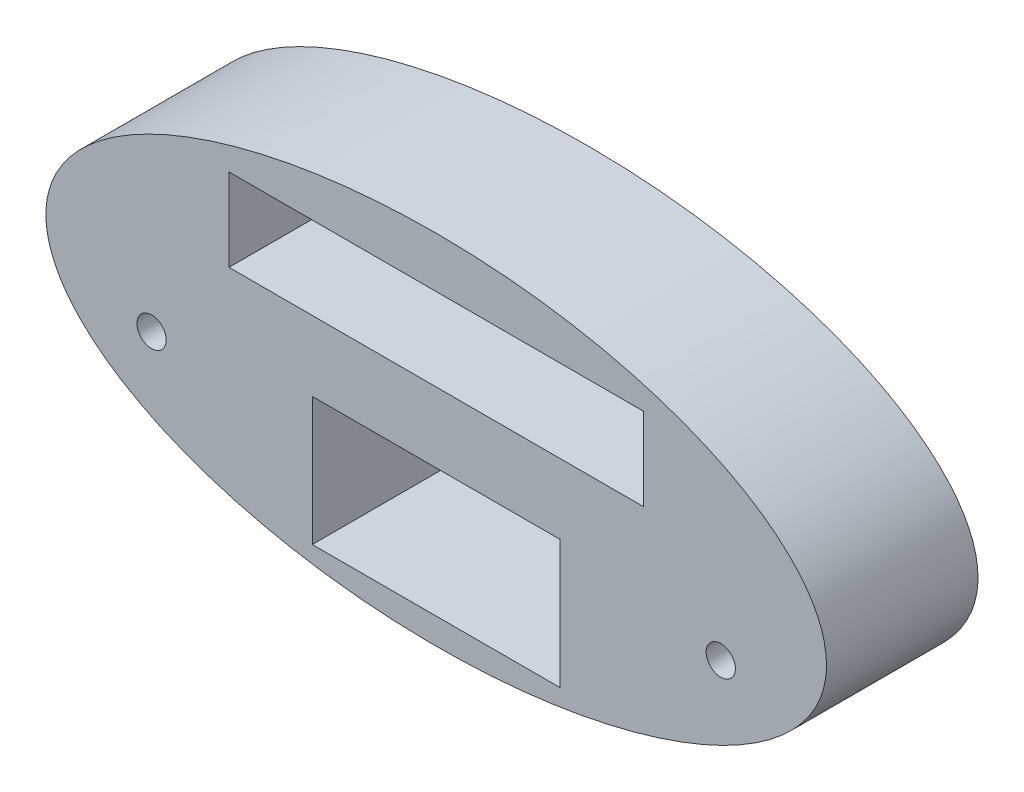
ISO-10303-21;
HEADER;
FILE_DESCRIPTION(('STEP AP214'),'2;1');
FILE_NAME('part.step','',(''),(''),'','','');
FILE_SCHEMA(('AUTOMOTIVE_DESIGN { 1 0 10303 214 1 1 1 1 }'));
ENDSEC;
DATA;
#1=APPLICATION_CONTEXT('core data for automotive mechanical design processes');
#2=APPLICATION_PROTOCOL_DEFINITION('international standard','automotive_design',2000,#1);
#3=PRODUCT_CONTEXT('',#1,'mechanical');
#4=PRODUCT('Part','Part','',(#3));
#5=PRODUCT_RELATED_PRODUCT_CATEGORY('part','',(#4));
#6=PRODUCT_DEFINITION_FORMATION('','',#4);
#7=PRODUCT_DEFINITION_CONTEXT('part definition',#1,'design');
#8=PRODUCT_DEFINITION('design','',#6,#7);
#9=PRODUCT_DEFINITION_SHAPE('','',#8);
#10=(LENGTH_UNIT() NAMED_UNIT(*) SI_UNIT(.MILLI.,.METRE.));
#11=(NAMED_UNIT(*) PLANE_ANGLE_UNIT() SI_UNIT($,.RADIAN.));
#12=(NAMED_UNIT(*) SI_UNIT($,.STERADIAN.) SOLID_ANGLE_UNIT());
#13=UNCERTAINTY_MEASURE_WITH_UNIT(LENGTH_MEASURE(1.E-05),#10,'distance_accuracy_value','');
#14=(GEOMETRIC_REPRESENTATION_CONTEXT(3) GLOBAL_UNCERTAINTY_ASSIGNED_CONTEXT((#13)) GLOBAL_UNIT_ASSIGNED_CONTEXT((#10,
#11,#12)) REPRESENTATION_CONTEXT('',''));
#15=CARTESIAN_POINT('',(0.,0.,0.));
#16=DIRECTION('',(0.,0.,1.));
#17=DIRECTION('',(1.,0.,0.));
#18=AXIS2_PLACEMENT_3D('',#15,#16,#17);
#19=CARTESIAN_POINT('',(0.,0.,-93.165));
#20=DIRECTION('',(0.,0.,1.));
#21=DIRECTION('',(1.,0.,0.));
#22=AXIS2_PLACEMENT_3D('',#19,#20,#21);
#23=ELLIPSE('',#22,240.,110.);
#24=DIRECTION('',(0.,0.,1.));
#25=VECTOR('',#24,1.);
#26=SURFACE_OF_LINEAR_EXTRUSION('',#23,#25);
#27=CARTESIAN_POINT('',(240.,0.,-93.165));
#28=VERTEX_POINT('',#27);
#29=EDGE_CURVE('E11',#28,#28,#23,.T.);
#30=ORIENTED_EDGE('',*,*,#29,.T.);
#31=EDGE_LOOP('',(#30));
#32=FACE_BOUND('',#31,.T.);
#33=CARTESIAN_POINT('',(0.,0.,0.));
#34=DIRECTION('',(0.,0.,1.));
#35=DIRECTION('',(1.,0.,0.));
#36=AXIS2_PLACEMENT_3D('',#33,#34,#35);
#37=ELLIPSE('',#36,240.,110.);
#38=CARTESIAN_POINT('',(240.,0.,0.));
#39=VERTEX_POINT('',#38);
#40=EDGE_CURVE('E39',#39,#39,#37,.T.);
#41=ORIENTED_EDGE('',*,*,#40,.F.);
#42=EDGE_LOOP('',(#41));
#43=FACE_BOUND('',#42,.T.);
#44=ADVANCED_FACE('F35',(#32,#43),#26,.T.);
#45=CARTESIAN_POINT('',(0.,0.,-93.165));
#46=DIRECTION('',(0.,0.,1.));
#47=DIRECTION('',(1.,0.,0.));
#48=AXIS2_PLACEMENT_3D('',#45,#46,#47);
#49=PLANE('',#48);
#50=CARTESIAN_POINT('',(175.,-30.,-93.165));
#51=DIRECTION('',(0.,0.,1.));
#52=DIRECTION('',(1.,0.,0.));
#53=AXIS2_PLACEMENT_3D('',#50,#51,#52);
#54=CIRCLE('',#53,9.00000000000001);
#55=CARTESIAN_POINT('',(184.,-30.,-93.165));
#56=VERTEX_POINT('',#55);
#57=EDGE_CURVE('E130',#56,#56,#54,.T.);
#58=ORIENTED_EDGE('',*,*,#57,.T.);
#59=EDGE_LOOP('',(#58));
#60=FACE_BOUND('',#59,.T.);
#61=CARTESIAN_POINT('',(-175.,-30.,-93.165));
#62=DIRECTION('',(0.,0.,1.));
#63=DIRECTION('',(-1.,0.,0.));
#64=AXIS2_PLACEMENT_3D('',#61,#62,#63);
#65=CIRCLE('',#64,9.00000000000001);
#66=CARTESIAN_POINT('',(-184.,-30.,-93.165));
#67=VERTEX_POINT('',#66);
#68=EDGE_CURVE('E248',#67,#67,#65,.T.);
#69=ORIENTED_EDGE('',*,*,#68,.T.);
#70=EDGE_LOOP('',(#69));
#71=FACE_BOUND('',#70,.T.);
#72=DIRECTION('',(-1.,0.,0.));
#73=VECTOR('',#72,1.);
#74=CARTESIAN_POINT('',(-76.2,-15.,-93.165));
#75=LINE('',#74,#73);
#76=CARTESIAN_POINT('',(76.2,-15.,-93.165));
#77=VERTEX_POINT('',#76);
#78=CARTESIAN_POINT('',(-76.2,-15.,-93.165));
#79=VERTEX_POINT('',#78);
#80=EDGE_CURVE('E107',#77,#79,#75,.T.);
#81=ORIENTED_EDGE('',*,*,#80,.T.);
#82=DIRECTION('',(0.,-1.,0.));
#83=VECTOR('',#82,1.);
#84=CARTESIAN_POINT('',(-76.2,-15.,-93.165));
#85=LINE('',#84,#83);
#86=CARTESIAN_POINT('',(-76.2,-93.9,-93.165));
#87=VERTEX_POINT('',#86);
#88=EDGE_CURVE('E101',#79,#87,#85,.T.);
#89=ORIENTED_EDGE('',*,*,#88,.T.);
#90=DIRECTION('',(1.,0.,0.));
#91=VECTOR('',#90,1.);
#92=CARTESIAN_POINT('',(-76.2,-93.9,-93.165));
#93=LINE('',#92,#91);
#94=CARTESIAN_POINT('',(76.2,-93.9,-93.165));
#95=VERTEX_POINT('',#94);
#96=EDGE_CURVE('E110',#87,#95,#93,.T.);
#97=ORIENTED_EDGE('',*,*,#96,.T.);
#98=DIRECTION('',(0.,1.,0.));
#99=VECTOR('',#98,1.);
#100=CARTESIAN_POINT('',(76.2,-15.,-93.165));
#101=LINE('',#100,#99);
#102=EDGE_CURVE('E49',#95,#77,#101,.T.);
#103=ORIENTED_EDGE('',*,*,#102,.T.);
#104=EDGE_LOOP('',(#81,#89,#97,#103));
#105=FACE_BOUND('',#104,.T.);
#106=DIRECTION('',(-1.,0.,0.));
#107=VECTOR('',#106,1.);
#108=CARTESIAN_POINT('',(-127.4,78.9000000000001,-93.165));
#109=LINE('',#108,#107);
#110=CARTESIAN_POINT('',(127.4,78.9,-93.165));
#111=VERTEX_POINT('',#110);
#112=CARTESIAN_POINT('',(-127.4,78.9000000000001,-93.165));
#113=VERTEX_POINT('',#112);
#114=EDGE_CURVE('E150',#111,#113,#109,.T.);
#115=ORIENTED_EDGE('',*,*,#114,.T.);
#116=DIRECTION('',(0.,-1.,0.));
#117=VECTOR('',#116,1.);
#118=CARTESIAN_POINT('',(-127.4,78.9000000000001,-93.165));
#119=LINE('',#118,#117);
#120=CARTESIAN_POINT('',(-127.4,28.1,-93.165));
#121=VERTEX_POINT('',#120);
#122=EDGE_CURVE('E140',#113,#121,#119,.T.);
#123=ORIENTED_EDGE('',*,*,#122,.T.);
#124=DIRECTION('',(1.,0.,0.));
#125=VECTOR('',#124,1.);
#126=CARTESIAN_POINT('',(-127.4,28.1,-93.165));
#127=LINE('',#126,#125);
#128=CARTESIAN_POINT('',(127.4,28.1,-93.165));
#129=VERTEX_POINT('',#128);
#130=EDGE_CURVE('E143',#121,#129,#127,.T.);
#131=ORIENTED_EDGE('',*,*,#130,.T.);
#132=DIRECTION('',(0.,1.,0.));
#133=VECTOR('',#132,1.);
#134=CARTESIAN_POINT('',(127.4,78.9,-93.165));
#135=LINE('',#134,#133);
#136=EDGE_CURVE('E147',#129,#111,#135,.T.);
#137=ORIENTED_EDGE('',*,*,#136,.T.);
#138=EDGE_LOOP('',(#115,#123,#131,#137));
#139=FACE_BOUND('',#138,.T.);
#140=ORIENTED_EDGE('',*,*,#29,.F.);
#141=EDGE_LOOP('',(#140));
#142=FACE_BOUND('',#141,.T.);
#143=ADVANCED_FACE('F114',(#60,#71,#105,#139,#142),#49,.F.);
#144=CARTESIAN_POINT('',(0.,0.,0.));
#145=DIRECTION('',(0.,0.,1.));
#146=DIRECTION('',(1.,0.,0.));
#147=AXIS2_PLACEMENT_3D('',#144,#145,#146);
#148=PLANE('',#147);
#149=CARTESIAN_POINT('',(175.,-30.,0.));
#150=DIRECTION('',(0.,0.,1.));
#151=DIRECTION('',(1.,0.,0.));
#152=AXIS2_PLACEMENT_3D('',#149,#150,#151);
#153=CIRCLE('',#152,9.00000000000001);
#154=CARTESIAN_POINT('',(184.,-30.,0.));
#155=VERTEX_POINT('',#154);
#156=EDGE_CURVE('E247',#155,#155,#153,.T.);
#157=ORIENTED_EDGE('',*,*,#156,.F.);
#158=EDGE_LOOP('',(#157));
#159=FACE_BOUND('',#158,.T.);
#160=CARTESIAN_POINT('',(-175.,-30.,0.));
#161=DIRECTION('',(0.,0.,1.));
#162=DIRECTION('',(-1.,0.,0.));
#163=AXIS2_PLACEMENT_3D('',#160,#161,#162);
#164=CIRCLE('',#163,9.00000000000001);
#165=CARTESIAN_POINT('',(-184.,-30.,0.));
#166=VERTEX_POINT('',#165);
#167=EDGE_CURVE('E123',#166,#166,#164,.T.);
#168=ORIENTED_EDGE('',*,*,#167,.F.);
#169=EDGE_LOOP('',(#168));
#170=FACE_BOUND('',#169,.T.);
#171=DIRECTION('',(0.,-1.,0.));
#172=VECTOR('',#171,1.);
#173=CARTESIAN_POINT('',(-76.2,-15.,0.));
#174=LINE('',#173,#172);
#175=CARTESIAN_POINT('',(-76.2,-15.,0.));
#176=VERTEX_POINT('',#175);
#177=CARTESIAN_POINT('',(-76.2,-93.9,0.));
#178=VERTEX_POINT('',#177);
#179=EDGE_CURVE('E57',#176,#178,#174,.T.);
#180=ORIENTED_EDGE('',*,*,#179,.F.);
#181=DIRECTION('',(-1.,0.,0.));
#182=VECTOR('',#181,1.);
#183=CARTESIAN_POINT('',(-76.2,-15.,0.));
#184=LINE('',#183,#182);
#185=CARTESIAN_POINT('',(76.2,-15.,0.));
#186=VERTEX_POINT('',#185);
#187=EDGE_CURVE('E117',#186,#176,#184,.T.);
#188=ORIENTED_EDGE('',*,*,#187,.F.);
#189=DIRECTION('',(0.,1.,0.));
#190=VECTOR('',#189,1.);
#191=CARTESIAN_POINT('',(76.2,-15.,0.));
#192=LINE('',#191,#190);
#193=CARTESIAN_POINT('',(76.2,-93.9,0.));
#194=VERTEX_POINT('',#193);
#195=EDGE_CURVE('E120',#194,#186,#192,.T.);
#196=ORIENTED_EDGE('',*,*,#195,.F.);
#197=DIRECTION('',(1.,0.,0.));
#198=VECTOR('',#197,1.);
#199=CARTESIAN_POINT('',(-76.2,-93.9,0.));
#200=LINE('',#199,#198);
#201=EDGE_CURVE('E129',#178,#194,#200,.T.);
#202=ORIENTED_EDGE('',*,*,#201,.F.);
#203=EDGE_LOOP('',(#180,#188,#196,#202));
#204=FACE_BOUND('',#203,.T.);
#205=DIRECTION('',(0.,-1.,0.));
#206=VECTOR('',#205,1.);
#207=CARTESIAN_POINT('',(-127.4,78.9000000000001,0.));
#208=LINE('',#207,#206);
#209=CARTESIAN_POINT('',(-127.4,78.9000000000001,0.));
#210=VERTEX_POINT('',#209);
#211=CARTESIAN_POINT('',(-127.4,28.1,0.));
#212=VERTEX_POINT('',#211);
#213=EDGE_CURVE('E136',#210,#212,#208,.T.);
#214=ORIENTED_EDGE('',*,*,#213,.F.);
#215=DIRECTION('',(-1.,0.,0.));
#216=VECTOR('',#215,1.);
#217=CARTESIAN_POINT('',(-127.4,78.9000000000001,0.));
#218=LINE('',#217,#216);
#219=CARTESIAN_POINT('',(127.4,78.9,0.));
#220=VERTEX_POINT('',#219);
#221=EDGE_CURVE('E144',#220,#210,#218,.T.);
#222=ORIENTED_EDGE('',*,*,#221,.F.);
#223=DIRECTION('',(0.,1.,0.));
#224=VECTOR('',#223,1.);
#225=CARTESIAN_POINT('',(127.4,78.9,0.));
#226=LINE('',#225,#224);
#227=CARTESIAN_POINT('',(127.4,28.1,0.));
#228=VERTEX_POINT('',#227);
#229=EDGE_CURVE('E158',#228,#220,#226,.T.);
#230=ORIENTED_EDGE('',*,*,#229,.F.);
#231=DIRECTION('',(1.,0.,0.));
#232=VECTOR('',#231,1.);
#233=CARTESIAN_POINT('',(-127.4,28.1,0.));
#234=LINE('',#233,#232);
#235=EDGE_CURVE('E155',#212,#228,#234,.T.);
#236=ORIENTED_EDGE('',*,*,#235,.F.);
#237=EDGE_LOOP('',(#214,#222,#230,#236));
#238=FACE_BOUND('',#237,.T.);
#239=ORIENTED_EDGE('',*,*,#40,.T.);
#240=EDGE_LOOP('',(#239));
#241=FACE_BOUND('',#240,.T.);
#242=ADVANCED_FACE('F181',(#159,#170,#204,#238,#241),#148,.T.);
#243=CARTESIAN_POINT('',(-127.4,78.9000000000001,-93.165));
#244=DIRECTION('',(-1.,0.,0.));
#245=DIRECTION('',(0.,0.,1.));
#246=AXIS2_PLACEMENT_3D('',#243,#244,#245);
#247=PLANE('',#246);
#248=ORIENTED_EDGE('',*,*,#213,.T.);
#249=DIRECTION('',(0.,0.,1.));
#250=VECTOR('',#249,1.);
#251=CARTESIAN_POINT('',(-127.4,28.1,-93.165));
#252=LINE('',#251,#250);
#253=EDGE_CURVE('E153',#121,#212,#252,.T.);
#254=ORIENTED_EDGE('',*,*,#253,.F.);
#255=ORIENTED_EDGE('',*,*,#122,.F.);
#256=DIRECTION('',(0.,0.,1.));
#257=VECTOR('',#256,1.);
#258=CARTESIAN_POINT('',(-127.4,78.9000000000001,-93.165));
#259=LINE('',#258,#257);
#260=EDGE_CURVE('E163',#113,#210,#259,.T.);
#261=ORIENTED_EDGE('',*,*,#260,.T.);
#262=EDGE_LOOP('',(#248,#254,#255,#261));
#263=FACE_BOUND('',#262,.T.);
#264=ADVANCED_FACE('F188',(#263),#247,.F.);
#265=CARTESIAN_POINT('',(-127.4,78.9000000000001,-93.165));
#266=DIRECTION('',(0.,1.,0.));
#267=DIRECTION('',(-1.,0.,0.));
#268=AXIS2_PLACEMENT_3D('',#265,#266,#267);
#269=PLANE('',#268);
#270=ORIENTED_EDGE('',*,*,#221,.T.);
#271=ORIENTED_EDGE('',*,*,#260,.F.);
#272=ORIENTED_EDGE('',*,*,#114,.F.);
#273=DIRECTION('',(0.,0.,1.));
#274=VECTOR('',#273,1.);
#275=CARTESIAN_POINT('',(127.4,78.9,-93.165));
#276=LINE('',#275,#274);
#277=EDGE_CURVE('E165',#111,#220,#276,.T.);
#278=ORIENTED_EDGE('',*,*,#277,.T.);
#279=EDGE_LOOP('',(#270,#271,#272,#278));
#280=FACE_BOUND('',#279,.T.);
#281=ADVANCED_FACE('F190',(#280),#269,.F.);
#282=CARTESIAN_POINT('',(127.4,78.9,-93.165));
#283=DIRECTION('',(1.,0.,0.));
#284=DIRECTION('',(0.,0.,-1.));
#285=AXIS2_PLACEMENT_3D('',#282,#283,#284);
#286=PLANE('',#285);
#287=ORIENTED_EDGE('',*,*,#229,.T.);
#288=ORIENTED_EDGE('',*,*,#277,.F.);
#289=ORIENTED_EDGE('',*,*,#136,.F.);
#290=DIRECTION('',(0.,0.,1.));
#291=VECTOR('',#290,1.);
#292=CARTESIAN_POINT('',(127.4,28.1,-93.165));
#293=LINE('',#292,#291);
#294=EDGE_CURVE('E167',#129,#228,#293,.T.);
#295=ORIENTED_EDGE('',*,*,#294,.T.);
#296=EDGE_LOOP('',(#287,#288,#289,#295));
#297=FACE_BOUND('',#296,.T.);
#298=ADVANCED_FACE('F185',(#297),#286,.F.);
#299=CARTESIAN_POINT('',(-127.4,28.1,-93.165));
#300=DIRECTION('',(0.,-1.,0.));
#301=DIRECTION('',(1.,0.,0.));
#302=AXIS2_PLACEMENT_3D('',#299,#300,#301);
#303=PLANE('',#302);
#304=ORIENTED_EDGE('',*,*,#235,.T.);
#305=ORIENTED_EDGE('',*,*,#294,.F.);
#306=ORIENTED_EDGE('',*,*,#130,.F.);
#307=ORIENTED_EDGE('',*,*,#253,.T.);
#308=EDGE_LOOP('',(#304,#305,#306,#307));
#309=FACE_BOUND('',#308,.T.);
#310=ADVANCED_FACE('F174',(#309),#303,.F.);
#311=CARTESIAN_POINT('',(-76.2,-15.,-93.165));
#312=DIRECTION('',(-1.,0.,0.));
#313=DIRECTION('',(0.,-1.,0.));
#314=AXIS2_PLACEMENT_3D('',#311,#312,#313);
#315=PLANE('',#314);
#316=ORIENTED_EDGE('',*,*,#179,.T.);
#317=DIRECTION('',(0.,0.,1.));
#318=VECTOR('',#317,1.);
#319=CARTESIAN_POINT('',(-76.2,-93.9,-93.165));
#320=LINE('',#319,#318);
#321=EDGE_CURVE('E97',#87,#178,#320,.T.);
#322=ORIENTED_EDGE('',*,*,#321,.F.);
#323=ORIENTED_EDGE('',*,*,#88,.F.);
#324=DIRECTION('',(0.,0.,1.));
#325=VECTOR('',#324,1.);
#326=CARTESIAN_POINT('',(-76.2,-15.,-93.165));
#327=LINE('',#326,#325);
#328=EDGE_CURVE('E134',#79,#176,#327,.T.);
#329=ORIENTED_EDGE('',*,*,#328,.T.);
#330=EDGE_LOOP('',(#316,#322,#323,#329));
#331=FACE_BOUND('',#330,.T.);
#332=ADVANCED_FACE('F99',(#331),#315,.F.);
#333=CARTESIAN_POINT('',(-76.2,-15.,-93.165));
#334=DIRECTION('',(0.,1.,0.));
#335=DIRECTION('',(0.,0.,1.));
#336=AXIS2_PLACEMENT_3D('',#333,#334,#335);
#337=PLANE('',#336);
#338=ORIENTED_EDGE('',*,*,#187,.T.);
#339=ORIENTED_EDGE('',*,*,#328,.F.);
#340=ORIENTED_EDGE('',*,*,#80,.F.);
#341=DIRECTION('',(0.,0.,1.));
#342=VECTOR('',#341,1.);
#343=CARTESIAN_POINT('',(76.2,-15.,-93.165));
#344=LINE('',#343,#342);
#345=EDGE_CURVE('E137',#77,#186,#344,.T.);
#346=ORIENTED_EDGE('',*,*,#345,.T.);
#347=EDGE_LOOP('',(#338,#339,#340,#346));
#348=FACE_BOUND('',#347,.T.);
#349=ADVANCED_FACE('F222',(#348),#337,.F.);
#350=CARTESIAN_POINT('',(76.2,-15.,-93.165));
#351=DIRECTION('',(1.,0.,0.));
#352=DIRECTION('',(0.,1.,0.));
#353=AXIS2_PLACEMENT_3D('',#350,#351,#352);
#354=PLANE('',#353);
#355=ORIENTED_EDGE('',*,*,#195,.T.);
#356=ORIENTED_EDGE('',*,*,#345,.F.);
#357=ORIENTED_EDGE('',*,*,#102,.F.);
#358=DIRECTION('',(0.,0.,1.));
#359=VECTOR('',#358,1.);
#360=CARTESIAN_POINT('',(76.2,-93.9,-93.165));
#361=LINE('',#360,#359);
#362=EDGE_CURVE('E106',#95,#194,#361,.T.);
#363=ORIENTED_EDGE('',*,*,#362,.T.);
#364=EDGE_LOOP('',(#355,#356,#357,#363));
#365=FACE_BOUND('',#364,.T.);
#366=ADVANCED_FACE('F226',(#365),#354,.F.);
#367=CARTESIAN_POINT('',(-76.2,-93.9,-93.165));
#368=DIRECTION('',(0.,-1.,0.));
#369=DIRECTION('',(0.,0.,-1.));
#370=AXIS2_PLACEMENT_3D('',#367,#368,#369);
#371=PLANE('',#370);
#372=ORIENTED_EDGE('',*,*,#201,.T.);
#373=ORIENTED_EDGE('',*,*,#362,.F.);
#374=ORIENTED_EDGE('',*,*,#96,.F.);
#375=ORIENTED_EDGE('',*,*,#321,.T.);
#376=EDGE_LOOP('',(#372,#373,#374,#375));
#377=FACE_BOUND('',#376,.T.);
#378=ADVANCED_FACE('F111',(#377),#371,.F.);
#379=CARTESIAN_POINT('',(-175.,-30.,-93.165));
#380=DIRECTION('',(0.,0.,1.));
#381=DIRECTION('',(1.,0.,0.));
#382=AXIS2_PLACEMENT_3D('',#379,#380,#381);
#383=CYLINDRICAL_SURFACE('',#382,9.00000000000001);
#384=ORIENTED_EDGE('',*,*,#68,.F.);
#385=EDGE_LOOP('',(#384));
#386=FACE_BOUND('',#385,.T.);
#387=ORIENTED_EDGE('',*,*,#167,.T.);
#388=EDGE_LOOP('',(#387));
#389=FACE_BOUND('',#388,.T.);
#390=ADVANCED_FACE('F232',(#386,#389),#383,.F.);
#391=CARTESIAN_POINT('',(175.,-30.,-93.165));
#392=DIRECTION('',(0.,0.,1.));
#393=DIRECTION('',(1.,0.,0.));
#394=AXIS2_PLACEMENT_3D('',#391,#392,#393);
#395=CYLINDRICAL_SURFACE('',#394,9.00000000000001);
#396=ORIENTED_EDGE('',*,*,#57,.F.);
#397=EDGE_LOOP('',(#396));
#398=FACE_BOUND('',#397,.T.);
#399=ORIENTED_EDGE('',*,*,#156,.T.);
#400=EDGE_LOOP('',(#399));
#401=FACE_BOUND('',#400,.T.);
#402=ADVANCED_FACE('F237',(#398,#401),#395,.F.);
#403=CLOSED_SHELL('',(#44,#143,#242,#264,#281,#298,#310,#332,#349,#366,#378,#390,#402));
#404=MANIFOLD_SOLID_BREP('B2',#403);
#405=ADVANCED_BREP_SHAPE_REPRESENTATION('',(#18,#404),#14);
#406=SHAPE_DEFINITION_REPRESENTATION(#9,#405);
ENDSEC;
END-ISO-10303-21;
